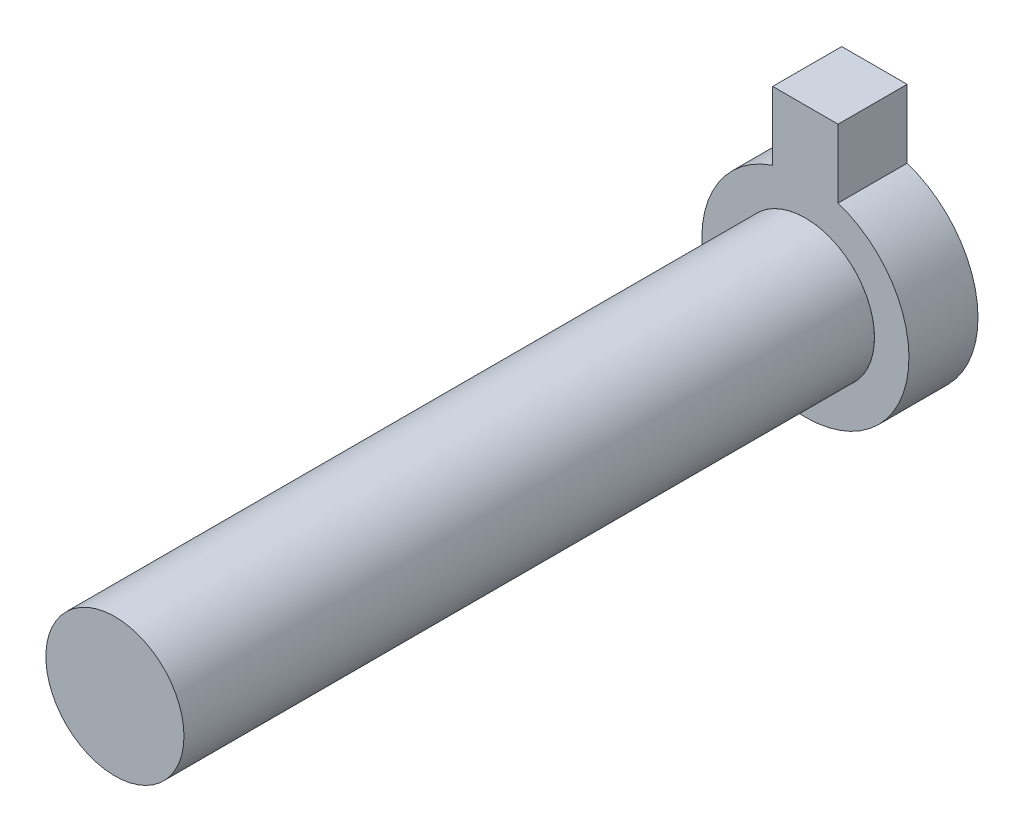
ISO-10303-21;
HEADER;
FILE_DESCRIPTION(('STEP AP214'),'2;1');
FILE_NAME('part.step','',(''),(''),'','','');
FILE_SCHEMA(('AUTOMOTIVE_DESIGN { 1 0 10303 214 1 1 1 1 }'));
ENDSEC;
DATA;
#1=APPLICATION_CONTEXT('core data for automotive mechanical design processes');
#2=APPLICATION_PROTOCOL_DEFINITION('international standard','automotive_design',2000,#1);
#3=PRODUCT_CONTEXT('',#1,'mechanical');
#4=PRODUCT('Part','Part','',(#3));
#5=PRODUCT_RELATED_PRODUCT_CATEGORY('part','',(#4));
#6=PRODUCT_DEFINITION_FORMATION('','',#4);
#7=PRODUCT_DEFINITION_CONTEXT('part definition',#1,'design');
#8=PRODUCT_DEFINITION('design','',#6,#7);
#9=PRODUCT_DEFINITION_SHAPE('','',#8);
#10=(LENGTH_UNIT() NAMED_UNIT(*) SI_UNIT(.MILLI.,.METRE.));
#11=(NAMED_UNIT(*) PLANE_ANGLE_UNIT() SI_UNIT($,.RADIAN.));
#12=(NAMED_UNIT(*) SI_UNIT($,.STERADIAN.) SOLID_ANGLE_UNIT());
#13=UNCERTAINTY_MEASURE_WITH_UNIT(LENGTH_MEASURE(1.E-05),#10,'distance_accuracy_value','');
#14=(GEOMETRIC_REPRESENTATION_CONTEXT(3) GLOBAL_UNCERTAINTY_ASSIGNED_CONTEXT((#13)) GLOBAL_UNIT_ASSIGNED_CONTEXT((#10,
#11,#12)) REPRESENTATION_CONTEXT('',''));
#15=CARTESIAN_POINT('',(0.,0.,0.));
#16=DIRECTION('',(0.,0.,1.));
#17=DIRECTION('',(1.,0.,0.));
#18=AXIS2_PLACEMENT_3D('',#15,#16,#17);
#19=CARTESIAN_POINT('',(0.,0.,-550.));
#20=DIRECTION('',(0.,0.,-1.));
#21=DIRECTION('',(-1.,0.,0.));
#22=AXIS2_PLACEMENT_3D('',#19,#20,#21);
#23=PLANE('',#22);
#24=CARTESIAN_POINT('',(0.,0.,-550.));
#25=DIRECTION('',(0.,0.,-1.));
#26=DIRECTION('',(-1.,0.,0.));
#27=AXIS2_PLACEMENT_3D('',#24,#25,#26);
#28=CIRCLE('',#27,50.);
#29=CARTESIAN_POINT('',(-50.,0.,-550.));
#30=VERTEX_POINT('',#29);
#31=EDGE_CURVE('E12',#30,#30,#28,.T.);
#32=ORIENTED_EDGE('',*,*,#31,.F.);
#33=EDGE_LOOP('',(#32));
#34=FACE_BOUND('',#33,.T.);
#35=CARTESIAN_POINT('',(0.,0.,-550.));
#36=DIRECTION('',(0.,0.,1.));
#37=DIRECTION('',(1.,0.,0.));
#38=AXIS2_PLACEMENT_3D('',#35,#36,#37);
#39=CIRCLE('',#38,75.);
#40=CARTESIAN_POINT('',(-23.6859144990908,71.1616290871826,-550.));
#41=VERTEX_POINT('',#40);
#42=CARTESIAN_POINT('',(23.6859144990908,71.1616290871826,-550.));
#43=VERTEX_POINT('',#42);
#44=EDGE_CURVE('E118',#41,#43,#39,.T.);
#45=ORIENTED_EDGE('',*,*,#44,.F.);
#46=DIRECTION('',(0.,1.,0.));
#47=VECTOR('',#46,1.);
#48=CARTESIAN_POINT('',(-23.6859144990908,120.661191056048,-550.));
#49=LINE('',#48,#47);
#50=CARTESIAN_POINT('',(-23.6859144990908,120.661191056048,-550.));
#51=VERTEX_POINT('',#50);
#52=EDGE_CURVE('E114',#41,#51,#49,.T.);
#53=ORIENTED_EDGE('',*,*,#52,.T.);
#54=DIRECTION('',(1.,0.,0.));
#55=VECTOR('',#54,1.);
#56=CARTESIAN_POINT('',(23.6859144990908,120.661191056048,-550.));
#57=LINE('',#56,#55);
#58=CARTESIAN_POINT('',(23.6859144990908,120.661191056048,-550.));
#59=VERTEX_POINT('',#58);
#60=EDGE_CURVE('E97',#51,#59,#57,.T.);
#61=ORIENTED_EDGE('',*,*,#60,.T.);
#62=DIRECTION('',(0.,-1.,0.));
#63=VECTOR('',#62,1.);
#64=CARTESIAN_POINT('',(23.6859144990908,120.661191056048,-550.));
#65=LINE('',#64,#63);
#66=EDGE_CURVE('E109',#59,#43,#65,.T.);
#67=ORIENTED_EDGE('',*,*,#66,.T.);
#68=EDGE_LOOP('',(#45,#53,#61,#67));
#69=FACE_BOUND('',#68,.T.);
#70=ADVANCED_FACE('F47',(#34,#69),#23,.T.);
#71=CARTESIAN_POINT('',(0.,0.,0.));
#72=DIRECTION('',(0.,0.,1.));
#73=DIRECTION('',(1.,0.,0.));
#74=AXIS2_PLACEMENT_3D('',#71,#72,#73);
#75=CYLINDRICAL_SURFACE('',#74,75.);
#76=DIRECTION('',(0.,0.,-1.));
#77=VECTOR('',#76,1.);
#78=CARTESIAN_POINT('',(23.6859144990908,71.1616290871826,-500.));
#79=LINE('',#78,#77);
#80=CARTESIAN_POINT('',(23.6859144990908,71.1616290871826,-500.));
#81=VERTEX_POINT('',#80);
#82=EDGE_CURVE('E87',#81,#43,#79,.T.);
#83=ORIENTED_EDGE('',*,*,#82,.F.);
#84=CARTESIAN_POINT('',(0.,0.,-500.));
#85=DIRECTION('',(0.,0.,1.));
#86=DIRECTION('',(1.,0.,0.));
#87=AXIS2_PLACEMENT_3D('',#84,#85,#86);
#88=CIRCLE('',#87,75.);
#89=CARTESIAN_POINT('',(-23.6859144990908,71.1616290871826,-500.));
#90=VERTEX_POINT('',#89);
#91=EDGE_CURVE('E123',#90,#81,#88,.T.);
#92=ORIENTED_EDGE('',*,*,#91,.F.);
#93=DIRECTION('',(0.,0.,-1.));
#94=VECTOR('',#93,1.);
#95=CARTESIAN_POINT('',(-23.6859144990908,71.1616290871826,-500.));
#96=LINE('',#95,#94);
#97=EDGE_CURVE('E101',#90,#41,#96,.T.);
#98=ORIENTED_EDGE('',*,*,#97,.T.);
#99=ORIENTED_EDGE('',*,*,#44,.T.);
#100=EDGE_LOOP('',(#83,#92,#98,#99));
#101=FACE_BOUND('',#100,.T.);
#102=ADVANCED_FACE('F134',(#101),#75,.T.);
#103=CARTESIAN_POINT('',(0.,-75.,-500.));
#104=DIRECTION('',(0.,0.,1.));
#105=DIRECTION('',(1.,0.,0.));
#106=AXIS2_PLACEMENT_3D('',#103,#104,#105);
#107=PLANE('',#106);
#108=ORIENTED_EDGE('',*,*,#91,.T.);
#109=DIRECTION('',(0.,-1.,0.));
#110=VECTOR('',#109,1.);
#111=CARTESIAN_POINT('',(23.6859144990908,120.661191056048,-500.));
#112=LINE('',#111,#110);
#113=CARTESIAN_POINT('',(23.6859144990908,120.661191056048,-500.));
#114=VERTEX_POINT('',#113);
#115=EDGE_CURVE('E71',#114,#81,#112,.T.);
#116=ORIENTED_EDGE('',*,*,#115,.F.);
#117=DIRECTION('',(1.,0.,0.));
#118=VECTOR('',#117,1.);
#119=CARTESIAN_POINT('',(23.6859144990908,120.661191056048,-500.));
#120=LINE('',#119,#118);
#121=CARTESIAN_POINT('',(-23.6859144990908,120.661191056048,-500.));
#122=VERTEX_POINT('',#121);
#123=EDGE_CURVE('E95',#122,#114,#120,.T.);
#124=ORIENTED_EDGE('',*,*,#123,.F.);
#125=DIRECTION('',(0.,1.,0.));
#126=VECTOR('',#125,1.);
#127=CARTESIAN_POINT('',(-23.6859144990908,120.661191056048,-500.));
#128=LINE('',#127,#126);
#129=EDGE_CURVE('E62',#90,#122,#128,.T.);
#130=ORIENTED_EDGE('',*,*,#129,.F.);
#131=EDGE_LOOP('',(#108,#116,#124,#130));
#132=FACE_BOUND('',#131,.T.);
#133=CARTESIAN_POINT('',(0.,0.,-500.));
#134=DIRECTION('',(0.,0.,-1.));
#135=DIRECTION('',(-1.,0.,0.));
#136=AXIS2_PLACEMENT_3D('',#133,#134,#135);
#137=CIRCLE('',#136,50.);
#138=CARTESIAN_POINT('',(-50.,0.,-500.));
#139=VERTEX_POINT('',#138);
#140=EDGE_CURVE('E51',#139,#139,#137,.T.);
#141=ORIENTED_EDGE('',*,*,#140,.T.);
#142=EDGE_LOOP('',(#141));
#143=FACE_BOUND('',#142,.T.);
#144=ADVANCED_FACE('F103',(#132,#143),#107,.T.);
#145=CARTESIAN_POINT('',(0.,0.,-500.));
#146=DIRECTION('',(0.,0.,-1.));
#147=DIRECTION('',(-1.,0.,0.));
#148=AXIS2_PLACEMENT_3D('',#145,#146,#147);
#149=CYLINDRICAL_SURFACE('',#148,50.);
#150=ORIENTED_EDGE('',*,*,#140,.F.);
#151=EDGE_LOOP('',(#150));
#152=FACE_BOUND('',#151,.T.);
#153=ORIENTED_EDGE('',*,*,#31,.T.);
#154=EDGE_LOOP('',(#153));
#155=FACE_BOUND('',#154,.T.);
#156=ADVANCED_FACE('F49',(#152,#155),#149,.F.);
#157=CARTESIAN_POINT('',(23.6859144990908,120.661191056048,-500.));
#158=DIRECTION('',(1.,0.,0.));
#159=DIRECTION('',(0.,0.,-1.));
#160=AXIS2_PLACEMENT_3D('',#157,#158,#159);
#161=PLANE('',#160);
#162=ORIENTED_EDGE('',*,*,#66,.F.);
#163=DIRECTION('',(0.,0.,-1.));
#164=VECTOR('',#163,1.);
#165=CARTESIAN_POINT('',(23.6859144990908,120.661191056048,-500.));
#166=LINE('',#165,#164);
#167=EDGE_CURVE('E100',#114,#59,#166,.T.);
#168=ORIENTED_EDGE('',*,*,#167,.F.);
#169=ORIENTED_EDGE('',*,*,#115,.T.);
#170=ORIENTED_EDGE('',*,*,#82,.T.);
#171=EDGE_LOOP('',(#162,#168,#169,#170));
#172=FACE_BOUND('',#171,.T.);
#173=ADVANCED_FACE('F129',(#172),#161,.T.);
#174=CARTESIAN_POINT('',(23.6859144990908,120.661191056048,-500.));
#175=DIRECTION('',(0.,1.,0.));
#176=DIRECTION('',(0.,0.,1.));
#177=AXIS2_PLACEMENT_3D('',#174,#175,#176);
#178=PLANE('',#177);
#179=ORIENTED_EDGE('',*,*,#60,.F.);
#180=DIRECTION('',(0.,0.,-1.));
#181=VECTOR('',#180,1.);
#182=CARTESIAN_POINT('',(-23.6859144990908,120.661191056048,-500.));
#183=LINE('',#182,#181);
#184=EDGE_CURVE('E93',#122,#51,#183,.T.);
#185=ORIENTED_EDGE('',*,*,#184,.F.);
#186=ORIENTED_EDGE('',*,*,#123,.T.);
#187=ORIENTED_EDGE('',*,*,#167,.T.);
#188=EDGE_LOOP('',(#179,#185,#186,#187));
#189=FACE_BOUND('',#188,.T.);
#190=ADVANCED_FACE('F94',(#189),#178,.T.);
#191=CARTESIAN_POINT('',(-23.6859144990908,120.661191056048,-500.));
#192=DIRECTION('',(-1.,0.,0.));
#193=DIRECTION('',(0.,0.,1.));
#194=AXIS2_PLACEMENT_3D('',#191,#192,#193);
#195=PLANE('',#194);
#196=ORIENTED_EDGE('',*,*,#52,.F.);
#197=ORIENTED_EDGE('',*,*,#97,.F.);
#198=ORIENTED_EDGE('',*,*,#129,.T.);
#199=ORIENTED_EDGE('',*,*,#184,.T.);
#200=EDGE_LOOP('',(#196,#197,#198,#199));
#201=FACE_BOUND('',#200,.T.);
#202=ADVANCED_FACE('F106',(#201),#195,.T.);
#203=CLOSED_SHELL('',(#70,#102,#144,#156,#173,#190,#202));
#204=MANIFOLD_SOLID_BREP('B2',#203);
#205=CARTESIAN_POINT('',(0.,-50.,0.));
#206=DIRECTION('',(0.,0.,1.));
#207=DIRECTION('',(1.,0.,0.));
#208=AXIS2_PLACEMENT_3D('',#205,#206,#207);
#209=PLANE('',#208);
#210=CARTESIAN_POINT('',(0.,0.,0.));
#211=DIRECTION('',(0.,0.,1.));
#212=DIRECTION('',(1.,0.,0.));
#213=AXIS2_PLACEMENT_3D('',#210,#211,#212);
#214=CIRCLE('',#213,50.);
#215=CARTESIAN_POINT('',(50.,0.,0.));
#216=VERTEX_POINT('',#215);
#217=EDGE_CURVE('E46',#216,#216,#214,.T.);
#218=ORIENTED_EDGE('',*,*,#217,.T.);
#219=EDGE_LOOP('',(#218));
#220=FACE_BOUND('',#219,.T.);
#221=ADVANCED_FACE('F197',(#220),#209,.T.);
#222=CARTESIAN_POINT('',(0.,0.,0.));
#223=DIRECTION('',(0.,0.,1.));
#224=DIRECTION('',(1.,0.,0.));
#225=AXIS2_PLACEMENT_3D('',#222,#223,#224);
#226=CYLINDRICAL_SURFACE('',#225,50.);
#227=CARTESIAN_POINT('',(0.,0.,-500.));
#228=DIRECTION('',(0.,0.,-1.));
#229=DIRECTION('',(-1.,0.,0.));
#230=AXIS2_PLACEMENT_3D('',#227,#228,#229);
#231=CIRCLE('',#230,50.);
#232=CARTESIAN_POINT('',(-50.,0.,-500.));
#233=VERTEX_POINT('',#232);
#234=EDGE_CURVE('E203',#233,#233,#231,.T.);
#235=ORIENTED_EDGE('',*,*,#234,.F.);
#236=EDGE_LOOP('',(#235));
#237=FACE_BOUND('',#236,.T.);
#238=ORIENTED_EDGE('',*,*,#217,.F.);
#239=EDGE_LOOP('',(#238));
#240=FACE_BOUND('',#239,.T.);
#241=ADVANCED_FACE('F211',(#237,#240),#226,.T.);
#242=CARTESIAN_POINT('',(0.,0.,-500.));
#243=DIRECTION('',(0.,0.,-1.));
#244=DIRECTION('',(-1.,0.,0.));
#245=AXIS2_PLACEMENT_3D('',#242,#243,#244);
#246=PLANE('',#245);
#247=ORIENTED_EDGE('',*,*,#234,.T.);
#248=EDGE_LOOP('',(#247));
#249=FACE_BOUND('',#248,.T.);
#250=ADVANCED_FACE('F209',(#249),#246,.T.);
#251=CLOSED_SHELL('',(#221,#241,#250));
#252=MANIFOLD_SOLID_BREP('B6',#251);
#253=ADVANCED_BREP_SHAPE_REPRESENTATION('',(#18,#204,#252),#14);
#254=SHAPE_DEFINITION_REPRESENTATION(#9,#253);
ENDSEC;
END-ISO-10303-21;
